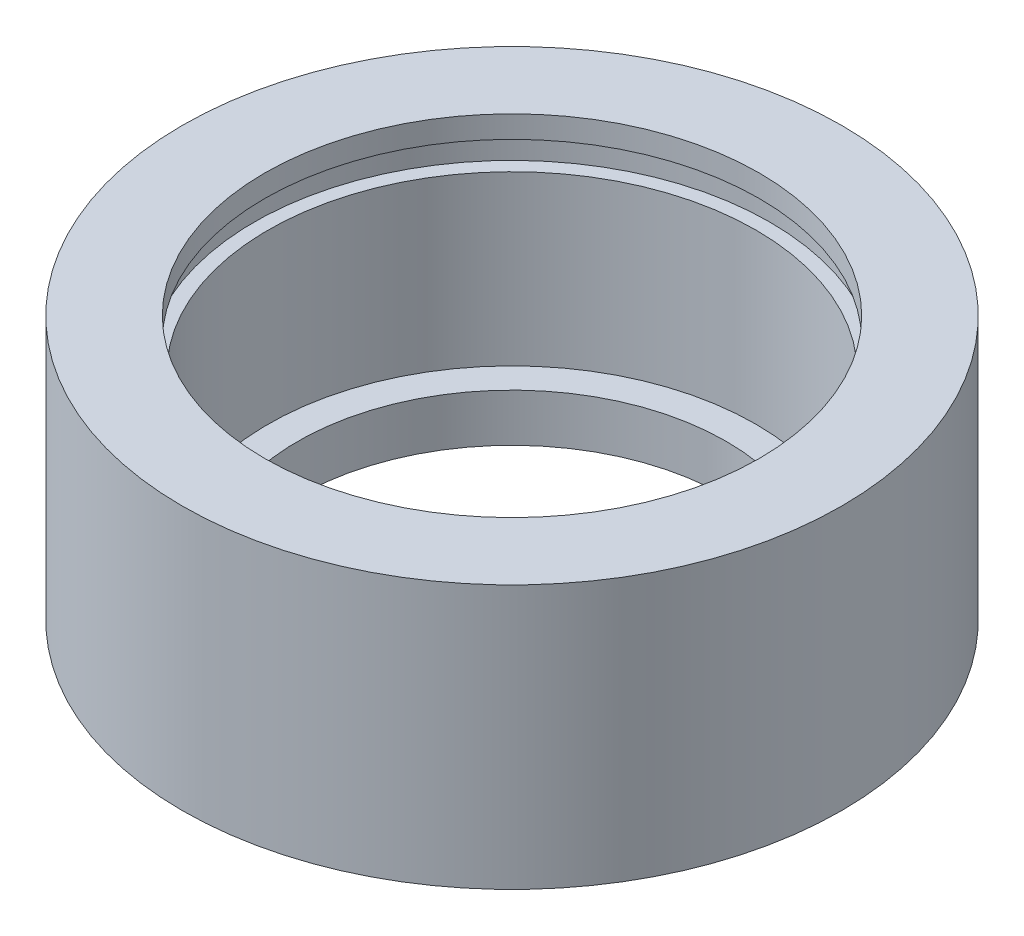
ISO-10303-21;
HEADER;
FILE_DESCRIPTION(('STEP AP214'),'2;1');
FILE_NAME('part.step','',(''),(''),'','','');
FILE_SCHEMA(('AUTOMOTIVE_DESIGN { 1 0 10303 214 1 1 1 1 }'));
ENDSEC;
DATA;
#1=APPLICATION_CONTEXT('core data for automotive mechanical design processes');
#2=APPLICATION_PROTOCOL_DEFINITION('international standard','automotive_design',2000,#1);
#3=PRODUCT_CONTEXT('',#1,'mechanical');
#4=PRODUCT('Part','Part','',(#3));
#5=PRODUCT_RELATED_PRODUCT_CATEGORY('part','',(#4));
#6=PRODUCT_DEFINITION_FORMATION('','',#4);
#7=PRODUCT_DEFINITION_CONTEXT('part definition',#1,'design');
#8=PRODUCT_DEFINITION('design','',#6,#7);
#9=PRODUCT_DEFINITION_SHAPE('','',#8);
#10=(LENGTH_UNIT() NAMED_UNIT(*) SI_UNIT(.MILLI.,.METRE.));
#11=(NAMED_UNIT(*) PLANE_ANGLE_UNIT() SI_UNIT($,.RADIAN.));
#12=(NAMED_UNIT(*) SI_UNIT($,.STERADIAN.) SOLID_ANGLE_UNIT());
#13=UNCERTAINTY_MEASURE_WITH_UNIT(LENGTH_MEASURE(1.E-05),#10,'distance_accuracy_value','');
#14=(GEOMETRIC_REPRESENTATION_CONTEXT(3) GLOBAL_UNCERTAINTY_ASSIGNED_CONTEXT((#13)) GLOBAL_UNIT_ASSIGNED_CONTEXT((#10,
#11,#12)) REPRESENTATION_CONTEXT('',''));
#15=CARTESIAN_POINT('',(0.,0.,0.));
#16=DIRECTION('',(0.,0.,1.));
#17=DIRECTION('',(1.,0.,0.));
#18=AXIS2_PLACEMENT_3D('',#15,#16,#17);
#19=CARTESIAN_POINT('',(0.,0.,0.));
#20=DIRECTION('',(0.,-1.,0.));
#21=DIRECTION('',(0.,0.,-1.));
#22=AXIS2_PLACEMENT_3D('',#19,#20,#21);
#23=CYLINDRICAL_SURFACE('',#22,12.7);
#24=CARTESIAN_POINT('',(0.,-5.08,0.));
#25=DIRECTION('',(0.,-1.,0.));
#26=DIRECTION('',(0.,0.,-1.));
#27=AXIS2_PLACEMENT_3D('',#24,#25,#26);
#28=CIRCLE('',#27,12.7);
#29=CARTESIAN_POINT('',(0.,-5.08,-12.7));
#30=VERTEX_POINT('',#29);
#31=EDGE_CURVE('E10',#30,#30,#28,.T.);
#32=ORIENTED_EDGE('',*,*,#31,.F.);
#33=EDGE_LOOP('',(#32));
#34=FACE_BOUND('',#33,.T.);
#35=CARTESIAN_POINT('',(0.,5.08,0.));
#36=DIRECTION('',(0.,-1.,0.));
#37=DIRECTION('',(0.,0.,-1.));
#38=AXIS2_PLACEMENT_3D('',#35,#36,#37);
#39=CIRCLE('',#38,12.7);
#40=CARTESIAN_POINT('',(0.,5.08,-12.7));
#41=VERTEX_POINT('',#40);
#42=EDGE_CURVE('E75',#41,#41,#39,.T.);
#43=ORIENTED_EDGE('',*,*,#42,.T.);
#44=EDGE_LOOP('',(#43));
#45=FACE_BOUND('',#44,.T.);
#46=ADVANCED_FACE('F41',(#34,#45),#23,.T.);
#47=CARTESIAN_POINT('',(-12.7,-5.08,0.));
#48=DIRECTION('',(0.,1.,0.));
#49=DIRECTION('',(0.,0.,1.));
#50=AXIS2_PLACEMENT_3D('',#47,#48,#49);
#51=PLANE('',#50);
#52=CARTESIAN_POINT('',(0.,-5.08,0.));
#53=DIRECTION('',(0.,-1.,0.));
#54=DIRECTION('',(0.,0.,-1.));
#55=AXIS2_PLACEMENT_3D('',#52,#53,#54);
#56=CIRCLE('',#55,8.255);
#57=CARTESIAN_POINT('',(0.,-5.08,-8.255));
#58=VERTEX_POINT('',#57);
#59=EDGE_CURVE('E47',#58,#58,#56,.T.);
#60=ORIENTED_EDGE('',*,*,#59,.F.);
#61=EDGE_LOOP('',(#60));
#62=FACE_BOUND('',#61,.T.);
#63=ORIENTED_EDGE('',*,*,#31,.T.);
#64=EDGE_LOOP('',(#63));
#65=FACE_BOUND('',#64,.T.);
#66=ADVANCED_FACE('F124',(#62,#65),#51,.F.);
#67=CARTESIAN_POINT('',(0.,0.,0.));
#68=DIRECTION('',(0.,-1.,0.));
#69=DIRECTION('',(0.,0.,-1.));
#70=AXIS2_PLACEMENT_3D('',#67,#68,#69);
#71=CYLINDRICAL_SURFACE('',#70,8.255);
#72=CARTESIAN_POINT('',(0.,-3.2385,0.));
#73=DIRECTION('',(0.,-1.,0.));
#74=DIRECTION('',(0.,0.,-1.));
#75=AXIS2_PLACEMENT_3D('',#72,#73,#74);
#76=CIRCLE('',#75,8.255);
#77=CARTESIAN_POINT('',(0.,-3.2385,-8.255));
#78=VERTEX_POINT('',#77);
#79=EDGE_CURVE('E51',#78,#78,#76,.T.);
#80=ORIENTED_EDGE('',*,*,#79,.F.);
#81=EDGE_LOOP('',(#80));
#82=FACE_BOUND('',#81,.T.);
#83=ORIENTED_EDGE('',*,*,#59,.T.);
#84=EDGE_LOOP('',(#83));
#85=FACE_BOUND('',#84,.T.);
#86=ADVANCED_FACE('F119',(#82,#85),#71,.F.);
#87=CARTESIAN_POINT('',(-8.255,-3.2385,0.));
#88=DIRECTION('',(0.,-1.,0.));
#89=DIRECTION('',(0.,0.,-1.));
#90=AXIS2_PLACEMENT_3D('',#87,#88,#89);
#91=PLANE('',#90);
#92=CARTESIAN_POINT('',(0.,-3.2385,0.));
#93=DIRECTION('',(0.,-1.,0.));
#94=DIRECTION('',(0.,0.,-1.));
#95=AXIS2_PLACEMENT_3D('',#92,#93,#94);
#96=CIRCLE('',#95,9.398);
#97=CARTESIAN_POINT('',(0.,-3.2385,-9.398));
#98=VERTEX_POINT('',#97);
#99=EDGE_CURVE('E55',#98,#98,#96,.T.);
#100=ORIENTED_EDGE('',*,*,#99,.F.);
#101=EDGE_LOOP('',(#100));
#102=FACE_BOUND('',#101,.T.);
#103=ORIENTED_EDGE('',*,*,#79,.T.);
#104=EDGE_LOOP('',(#103));
#105=FACE_BOUND('',#104,.T.);
#106=ADVANCED_FACE('F113',(#102,#105),#91,.F.);
#107=CARTESIAN_POINT('',(0.,0.,0.));
#108=DIRECTION('',(0.,-1.,0.));
#109=DIRECTION('',(0.,0.,-1.));
#110=AXIS2_PLACEMENT_3D('',#107,#108,#109);
#111=CYLINDRICAL_SURFACE('',#110,9.398);
#112=CARTESIAN_POINT('',(0.,3.2385,0.));
#113=DIRECTION('',(0.,-1.,0.));
#114=DIRECTION('',(0.,0.,-1.));
#115=AXIS2_PLACEMENT_3D('',#112,#113,#114);
#116=CIRCLE('',#115,9.398);
#117=CARTESIAN_POINT('',(0.,3.2385,-9.398));
#118=VERTEX_POINT('',#117);
#119=EDGE_CURVE('E60',#118,#118,#116,.T.);
#120=ORIENTED_EDGE('',*,*,#119,.F.);
#121=EDGE_LOOP('',(#120));
#122=FACE_BOUND('',#121,.T.);
#123=ORIENTED_EDGE('',*,*,#99,.T.);
#124=EDGE_LOOP('',(#123));
#125=FACE_BOUND('',#124,.T.);
#126=ADVANCED_FACE('F107',(#122,#125),#111,.F.);
#127=CARTESIAN_POINT('',(-9.398,3.2385,0.));
#128=DIRECTION('',(0.,-1.,0.));
#129=DIRECTION('',(0.,0.,-1.));
#130=AXIS2_PLACEMENT_3D('',#127,#128,#129);
#131=PLANE('',#130);
#132=CARTESIAN_POINT('',(0.,3.2385,0.));
#133=DIRECTION('',(0.,-1.,0.));
#134=DIRECTION('',(0.,0.,-1.));
#135=AXIS2_PLACEMENT_3D('',#132,#133,#134);
#136=CIRCLE('',#135,9.9314);
#137=CARTESIAN_POINT('',(0.,3.2385,-9.9314));
#138=VERTEX_POINT('',#137);
#139=EDGE_CURVE('E63',#138,#138,#136,.T.);
#140=ORIENTED_EDGE('',*,*,#139,.F.);
#141=EDGE_LOOP('',(#140));
#142=FACE_BOUND('',#141,.T.);
#143=ORIENTED_EDGE('',*,*,#119,.T.);
#144=EDGE_LOOP('',(#143));
#145=FACE_BOUND('',#144,.T.);
#146=ADVANCED_FACE('F101',(#142,#145),#131,.F.);
#147=CARTESIAN_POINT('',(0.,0.,0.));
#148=DIRECTION('',(0.,-1.,0.));
#149=DIRECTION('',(0.,0.,-1.));
#150=AXIS2_PLACEMENT_3D('',#147,#148,#149);
#151=CYLINDRICAL_SURFACE('',#150,9.9314);
#152=CARTESIAN_POINT('',(0.,4.2291,0.));
#153=DIRECTION('',(0.,-1.,0.));
#154=DIRECTION('',(0.,0.,-1.));
#155=AXIS2_PLACEMENT_3D('',#152,#153,#154);
#156=CIRCLE('',#155,9.9314);
#157=CARTESIAN_POINT('',(0.,4.2291,-9.9314));
#158=VERTEX_POINT('',#157);
#159=EDGE_CURVE('E66',#158,#158,#156,.T.);
#160=ORIENTED_EDGE('',*,*,#159,.F.);
#161=EDGE_LOOP('',(#160));
#162=FACE_BOUND('',#161,.T.);
#163=ORIENTED_EDGE('',*,*,#139,.T.);
#164=EDGE_LOOP('',(#163));
#165=FACE_BOUND('',#164,.T.);
#166=ADVANCED_FACE('F95',(#162,#165),#151,.F.);
#167=CARTESIAN_POINT('',(-9.9314,4.2291,0.));
#168=DIRECTION('',(0.,1.,0.));
#169=DIRECTION('',(0.,0.,1.));
#170=AXIS2_PLACEMENT_3D('',#167,#168,#169);
#171=PLANE('',#170);
#172=CARTESIAN_POINT('',(0.,4.2291,0.));
#173=DIRECTION('',(0.,-1.,0.));
#174=DIRECTION('',(0.,0.,-1.));
#175=AXIS2_PLACEMENT_3D('',#172,#173,#174);
#176=CIRCLE('',#175,9.525);
#177=CARTESIAN_POINT('',(0.,4.2291,-9.525));
#178=VERTEX_POINT('',#177);
#179=EDGE_CURVE('E69',#178,#178,#176,.T.);
#180=ORIENTED_EDGE('',*,*,#179,.F.);
#181=EDGE_LOOP('',(#180));
#182=FACE_BOUND('',#181,.T.);
#183=ORIENTED_EDGE('',*,*,#159,.T.);
#184=EDGE_LOOP('',(#183));
#185=FACE_BOUND('',#184,.T.);
#186=ADVANCED_FACE('F89',(#182,#185),#171,.F.);
#187=CARTESIAN_POINT('',(0.,0.,0.));
#188=DIRECTION('',(0.,-1.,0.));
#189=DIRECTION('',(0.,0.,-1.));
#190=AXIS2_PLACEMENT_3D('',#187,#188,#189);
#191=CYLINDRICAL_SURFACE('',#190,9.525);
#192=CARTESIAN_POINT('',(0.,5.08,0.));
#193=DIRECTION('',(0.,-1.,0.));
#194=DIRECTION('',(0.,0.,-1.));
#195=AXIS2_PLACEMENT_3D('',#192,#193,#194);
#196=CIRCLE('',#195,9.525);
#197=CARTESIAN_POINT('',(0.,5.08,-9.525));
#198=VERTEX_POINT('',#197);
#199=EDGE_CURVE('E72',#198,#198,#196,.T.);
#200=ORIENTED_EDGE('',*,*,#199,.F.);
#201=EDGE_LOOP('',(#200));
#202=FACE_BOUND('',#201,.T.);
#203=ORIENTED_EDGE('',*,*,#179,.T.);
#204=EDGE_LOOP('',(#203));
#205=FACE_BOUND('',#204,.T.);
#206=ADVANCED_FACE('F83',(#202,#205),#191,.F.);
#207=CARTESIAN_POINT('',(-9.525,5.08,0.));
#208=DIRECTION('',(0.,-1.,0.));
#209=DIRECTION('',(0.,0.,-1.));
#210=AXIS2_PLACEMENT_3D('',#207,#208,#209);
#211=PLANE('',#210);
#212=ORIENTED_EDGE('',*,*,#42,.F.);
#213=EDGE_LOOP('',(#212));
#214=FACE_BOUND('',#213,.T.);
#215=ORIENTED_EDGE('',*,*,#199,.T.);
#216=EDGE_LOOP('',(#215));
#217=FACE_BOUND('',#216,.T.);
#218=ADVANCED_FACE('F80',(#214,#217),#211,.F.);
#219=CLOSED_SHELL('',(#46,#66,#86,#106,#126,#146,#166,#186,#206,#218));
#220=MANIFOLD_SOLID_BREP('B2',#219);
#221=ADVANCED_BREP_SHAPE_REPRESENTATION('',(#18,#220),#14);
#222=SHAPE_DEFINITION_REPRESENTATION(#9,#221);
ENDSEC;
END-ISO-10303-21;
